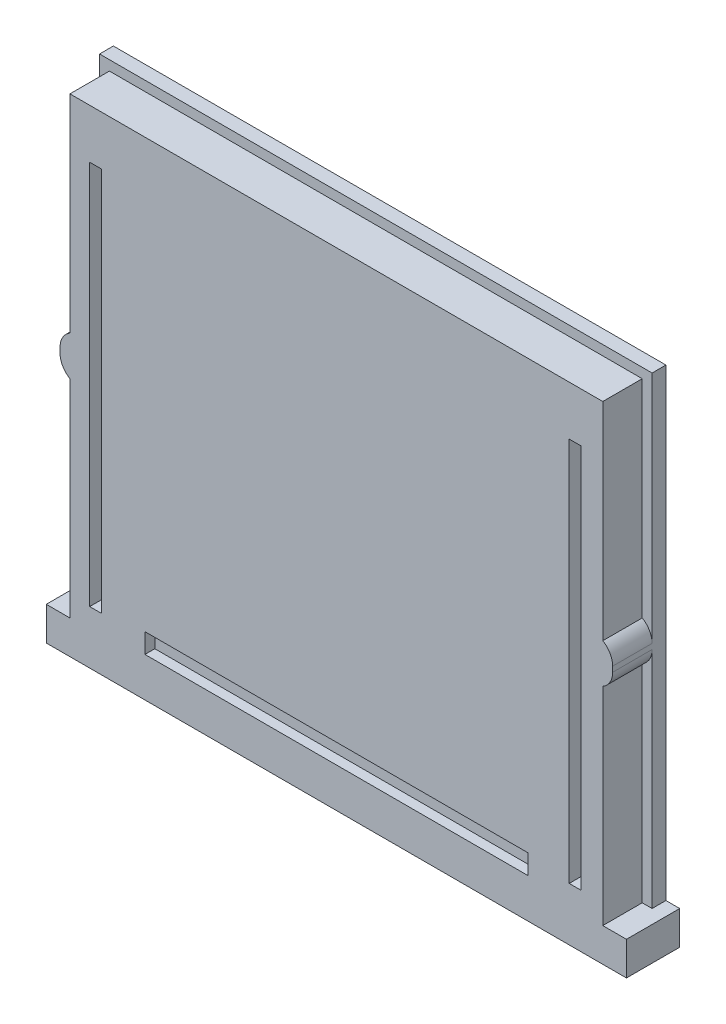
ISO-10303-21;
HEADER;
FILE_DESCRIPTION(('STEP AP214'),'2;1');
FILE_NAME('part.step','',(''),(''),'','','');
FILE_SCHEMA(('AUTOMOTIVE_DESIGN { 1 0 10303 214 1 1 1 1 }'));
ENDSEC;
DATA;
#1=APPLICATION_CONTEXT('core data for automotive mechanical design processes');
#2=APPLICATION_PROTOCOL_DEFINITION('international standard','automotive_design',2000,#1);
#3=PRODUCT_CONTEXT('',#1,'mechanical');
#4=PRODUCT('Part','Part','',(#3));
#5=PRODUCT_RELATED_PRODUCT_CATEGORY('part','',(#4));
#6=PRODUCT_DEFINITION_FORMATION('','',#4);
#7=PRODUCT_DEFINITION_CONTEXT('part definition',#1,'design');
#8=PRODUCT_DEFINITION('design','',#6,#7);
#9=PRODUCT_DEFINITION_SHAPE('','',#8);
#10=(LENGTH_UNIT() NAMED_UNIT(*) SI_UNIT(.MILLI.,.METRE.));
#11=(NAMED_UNIT(*) PLANE_ANGLE_UNIT() SI_UNIT($,.RADIAN.));
#12=(NAMED_UNIT(*) SI_UNIT($,.STERADIAN.) SOLID_ANGLE_UNIT());
#13=UNCERTAINTY_MEASURE_WITH_UNIT(LENGTH_MEASURE(1.E-05),#10,'distance_accuracy_value','');
#14=(GEOMETRIC_REPRESENTATION_CONTEXT(3) GLOBAL_UNCERTAINTY_ASSIGNED_CONTEXT((#13)) GLOBAL_UNIT_ASSIGNED_CONTEXT((#10,
#11,#12)) REPRESENTATION_CONTEXT('',''));
#15=CARTESIAN_POINT('',(0.,0.,0.));
#16=DIRECTION('',(0.,0.,1.));
#17=DIRECTION('',(1.,0.,0.));
#18=AXIS2_PLACEMENT_3D('',#15,#16,#17);
#19=CARTESIAN_POINT('',(33.3661324023902,23.,0.7));
#20=DIRECTION('',(0.,-1.,0.));
#21=DIRECTION('',(0.,0.,-1.));
#22=AXIS2_PLACEMENT_3D('',#19,#20,#21);
#23=PLANE('',#22);
#24=DIRECTION('',(1.,0.,0.));
#25=VECTOR('',#24,1.);
#26=CARTESIAN_POINT('',(5.36613240239025,23.,0.7));
#27=LINE('',#26,#25);
#28=CARTESIAN_POINT('',(5.86613240239025,23.,0.7));
#29=VERTEX_POINT('',#28);
#30=CARTESIAN_POINT('',(32.8661324023902,23.,0.7));
#31=VERTEX_POINT('',#30);
#32=EDGE_CURVE('E11',#29,#31,#27,.T.);
#33=ORIENTED_EDGE('',*,*,#32,.F.);
#34=DIRECTION('',(0.,0.,1.));
#35=VECTOR('',#34,1.);
#36=CARTESIAN_POINT('',(5.86613240239025,23.,0.));
#37=LINE('',#36,#35);
#38=CARTESIAN_POINT('',(5.86613240239025,23.,2.7));
#39=VERTEX_POINT('',#38);
#40=EDGE_CURVE('E303',#29,#39,#37,.T.);
#41=ORIENTED_EDGE('',*,*,#40,.T.);
#42=DIRECTION('',(-1.,0.,0.));
#43=VECTOR('',#42,1.);
#44=CARTESIAN_POINT('',(5.86613240239025,23.,2.7));
#45=LINE('',#44,#43);
#46=CARTESIAN_POINT('',(32.8661324023902,23.,2.7));
#47=VERTEX_POINT('',#46);
#48=EDGE_CURVE('E297',#47,#39,#45,.T.);
#49=ORIENTED_EDGE('',*,*,#48,.F.);
#50=DIRECTION('',(0.,0.,1.));
#51=VECTOR('',#50,1.);
#52=CARTESIAN_POINT('',(32.8661324023902,23.,0.));
#53=LINE('',#52,#51);
#54=EDGE_CURVE('E307',#31,#47,#53,.T.);
#55=ORIENTED_EDGE('',*,*,#54,.F.);
#56=EDGE_LOOP('',(#33,#41,#49,#55));
#57=FACE_BOUND('',#56,.T.);
#58=ADVANCED_FACE('F33',(#57),#23,.F.);
#59=CARTESIAN_POINT('',(0.,0.,0.7));
#60=DIRECTION('',(0.,0.,-1.));
#61=DIRECTION('',(-1.,0.,0.));
#62=AXIS2_PLACEMENT_3D('',#59,#60,#61);
#63=PLANE('',#62);
#64=DIRECTION('',(0.,-1.,0.));
#65=VECTOR('',#64,1.);
#66=CARTESIAN_POINT('',(5.86613240239025,22.5,0.7));
#67=LINE('',#66,#65);
#68=CARTESIAN_POINT('',(5.86613240239025,10.5,0.7));
#69=VERTEX_POINT('',#68);
#70=CARTESIAN_POINT('',(5.86613240239026,0.,0.7));
#71=VERTEX_POINT('',#70);
#72=EDGE_CURVE('E394',#69,#71,#67,.T.);
#73=ORIENTED_EDGE('',*,*,#72,.F.);
#74=CARTESIAN_POINT('',(6.36613240239025,11.3660254037844,0.7));
#75=DIRECTION('',(0.,0.,-1.));
#76=DIRECTION('',(-1.,0.,0.));
#77=AXIS2_PLACEMENT_3D('',#74,#75,#76);
#78=CIRCLE('',#77,1.);
#79=CARTESIAN_POINT('',(5.36613240239025,11.3660254037844,0.7));
#80=VERTEX_POINT('',#79);
#81=EDGE_CURVE('E473',#69,#80,#78,.T.);
#82=ORIENTED_EDGE('',*,*,#81,.T.);
#83=DIRECTION('',(0.,-1.,0.));
#84=VECTOR('',#83,1.);
#85=CARTESIAN_POINT('',(5.36613240239025,23.,0.7));
#86=LINE('',#85,#84);
#87=CARTESIAN_POINT('',(5.36613240239025,0.,0.7));
#88=VERTEX_POINT('',#87);
#89=EDGE_CURVE('E417',#80,#88,#86,.T.);
#90=ORIENTED_EDGE('',*,*,#89,.T.);
#91=DIRECTION('',(1.,0.,0.));
#92=VECTOR('',#91,1.);
#93=CARTESIAN_POINT('',(33.3661324023902,0.,0.7));
#94=LINE('',#93,#92);
#95=EDGE_CURVE('E422',#88,#71,#94,.T.);
#96=ORIENTED_EDGE('',*,*,#95,.T.);
#97=EDGE_LOOP('',(#73,#82,#90,#96));
#98=FACE_BOUND('',#97,.T.);
#99=ADVANCED_FACE('F540',(#98),#63,.F.);
#100=CARTESIAN_POINT('',(5.86613240239025,22.5,2.7));
#101=DIRECTION('',(1.,0.,0.));
#102=DIRECTION('',(0.,1.,0.));
#103=AXIS2_PLACEMENT_3D('',#100,#101,#102);
#104=PLANE('',#103);
#105=DIRECTION('',(0.,0.,1.));
#106=VECTOR('',#105,1.);
#107=CARTESIAN_POINT('',(5.86613240239025,10.5,0.7));
#108=LINE('',#107,#106);
#109=CARTESIAN_POINT('',(5.86613240239025,10.5,2.7));
#110=VERTEX_POINT('',#109);
#111=EDGE_CURVE('E316',#69,#110,#108,.T.);
#112=ORIENTED_EDGE('',*,*,#111,.F.);
#113=ORIENTED_EDGE('',*,*,#72,.T.);
#114=DIRECTION('',(0.,0.,-1.));
#115=VECTOR('',#114,1.);
#116=CARTESIAN_POINT('',(5.86613240239025,0.,2.7));
#117=LINE('',#116,#115);
#118=CARTESIAN_POINT('',(5.86613240239025,0.,2.7));
#119=VERTEX_POINT('',#118);
#120=EDGE_CURVE('E411',#119,#71,#117,.T.);
#121=ORIENTED_EDGE('',*,*,#120,.F.);
#122=DIRECTION('',(0.,-1.,0.));
#123=VECTOR('',#122,1.);
#124=CARTESIAN_POINT('',(5.86613240239025,22.5,2.7));
#125=LINE('',#124,#123);
#126=EDGE_CURVE('E398',#110,#119,#125,.T.);
#127=ORIENTED_EDGE('',*,*,#126,.F.);
#128=EDGE_LOOP('',(#112,#113,#121,#127));
#129=FACE_BOUND('',#128,.T.);
#130=ADVANCED_FACE('F548',(#129),#104,.F.);
#131=DIRECTION('',(0.,0.,-1.));
#132=VECTOR('',#131,1.);
#133=CARTESIAN_POINT('',(5.86613240239025,12.5,0.7));
#134=LINE('',#133,#132);
#135=CARTESIAN_POINT('',(5.86613240239025,12.5,2.7));
#136=VERTEX_POINT('',#135);
#137=CARTESIAN_POINT('',(5.86613240239025,12.5,0.7));
#138=VERTEX_POINT('',#137);
#139=EDGE_CURVE('E321',#136,#138,#134,.T.);
#140=ORIENTED_EDGE('',*,*,#139,.F.);
#141=EDGE_CURVE('E395',#39,#136,#125,.T.);
#142=ORIENTED_EDGE('',*,*,#141,.F.);
#143=ORIENTED_EDGE('',*,*,#40,.F.);
#144=EDGE_CURVE('E403',#29,#138,#67,.T.);
#145=ORIENTED_EDGE('',*,*,#144,.T.);
#146=EDGE_LOOP('',(#140,#142,#143,#145));
#147=FACE_BOUND('',#146,.T.);
#148=ADVANCED_FACE('F624',(#147),#104,.F.);
#149=DIRECTION('',(0.,1.,0.));
#150=VECTOR('',#149,1.);
#151=CARTESIAN_POINT('',(33.3661324023902,23.,0.7));
#152=LINE('',#151,#150);
#153=CARTESIAN_POINT('',(33.3661324023902,0.,0.7));
#154=VERTEX_POINT('',#153);
#155=CARTESIAN_POINT('',(33.3661324023902,11.3660254037844,0.7));
#156=VERTEX_POINT('',#155);
#157=EDGE_CURVE('E415',#154,#156,#152,.T.);
#158=ORIENTED_EDGE('',*,*,#157,.T.);
#159=CARTESIAN_POINT('',(32.3661324023902,11.3660254037844,0.7));
#160=DIRECTION('',(0.,0.,-1.));
#161=DIRECTION('',(-1.,0.,0.));
#162=AXIS2_PLACEMENT_3D('',#159,#160,#161);
#163=CIRCLE('',#162,1.);
#164=CARTESIAN_POINT('',(32.8661324023902,10.5,0.7));
#165=VERTEX_POINT('',#164);
#166=EDGE_CURVE('E456',#156,#165,#163,.T.);
#167=ORIENTED_EDGE('',*,*,#166,.T.);
#168=DIRECTION('',(0.,1.,0.));
#169=VECTOR('',#168,1.);
#170=CARTESIAN_POINT('',(32.8661324023902,22.5,0.7));
#171=LINE('',#170,#169);
#172=CARTESIAN_POINT('',(32.8661324023902,0.,0.7));
#173=VERTEX_POINT('',#172);
#174=EDGE_CURVE('E406',#173,#165,#171,.T.);
#175=ORIENTED_EDGE('',*,*,#174,.F.);
#176=EDGE_CURVE('E421',#173,#154,#94,.T.);
#177=ORIENTED_EDGE('',*,*,#176,.T.);
#178=EDGE_LOOP('',(#158,#167,#175,#177));
#179=FACE_BOUND('',#178,.T.);
#180=ADVANCED_FACE('F550',(#179),#63,.F.);
#181=CARTESIAN_POINT('',(33.3661324023902,11.6339745962156,0.7));
#182=VERTEX_POINT('',#181);
#183=CARTESIAN_POINT('',(33.3661324023902,23.5,0.7));
#184=VERTEX_POINT('',#183);
#185=EDGE_CURVE('E418',#182,#184,#152,.T.);
#186=ORIENTED_EDGE('',*,*,#185,.T.);
#187=DIRECTION('',(1.,0.,0.));
#188=VECTOR('',#187,1.);
#189=CARTESIAN_POINT('',(5.36613240239025,23.5,0.7));
#190=LINE('',#189,#188);
#191=CARTESIAN_POINT('',(5.36613240239025,23.5,0.7));
#192=VERTEX_POINT('',#191);
#193=EDGE_CURVE('E283',#192,#184,#190,.T.);
#194=ORIENTED_EDGE('',*,*,#193,.F.);
#195=CARTESIAN_POINT('',(5.36613240239025,11.6339745962156,0.7));
#196=VERTEX_POINT('',#195);
#197=EDGE_CURVE('E419',#192,#196,#86,.T.);
#198=ORIENTED_EDGE('',*,*,#197,.T.);
#199=CARTESIAN_POINT('',(6.36613240239025,11.6339745962156,0.7));
#200=DIRECTION('',(0.,0.,-1.));
#201=DIRECTION('',(-1.,0.,0.));
#202=AXIS2_PLACEMENT_3D('',#199,#200,#201);
#203=CIRCLE('',#202,1.);
#204=EDGE_CURVE('E471',#196,#138,#203,.T.);
#205=ORIENTED_EDGE('',*,*,#204,.T.);
#206=ORIENTED_EDGE('',*,*,#144,.F.);
#207=ORIENTED_EDGE('',*,*,#32,.T.);
#208=CARTESIAN_POINT('',(32.8661324023902,12.5,0.7));
#209=VERTEX_POINT('',#208);
#210=EDGE_CURVE('E405',#209,#31,#171,.T.);
#211=ORIENTED_EDGE('',*,*,#210,.F.);
#212=CARTESIAN_POINT('',(32.3661324023902,11.6339745962156,0.7));
#213=DIRECTION('',(0.,0.,-1.));
#214=DIRECTION('',(-1.,0.,0.));
#215=AXIS2_PLACEMENT_3D('',#212,#213,#214);
#216=CIRCLE('',#215,1.);
#217=EDGE_CURVE('E458',#209,#182,#216,.T.);
#218=ORIENTED_EDGE('',*,*,#217,.T.);
#219=EDGE_LOOP('',(#186,#194,#198,#205,#206,#207,#211,#218));
#220=FACE_BOUND('',#219,.T.);
#221=ADVANCED_FACE('F551',(#220),#63,.F.);
#222=CARTESIAN_POINT('',(32.8661324023902,22.5,2.7));
#223=DIRECTION('',(-1.,0.,0.));
#224=DIRECTION('',(0.,-1.,0.));
#225=AXIS2_PLACEMENT_3D('',#222,#223,#224);
#226=PLANE('',#225);
#227=DIRECTION('',(0.,0.,-1.));
#228=VECTOR('',#227,1.);
#229=CARTESIAN_POINT('',(32.8661324023902,10.5,2.7));
#230=LINE('',#229,#228);
#231=CARTESIAN_POINT('',(32.8661324023902,10.5,2.7));
#232=VERTEX_POINT('',#231);
#233=EDGE_CURVE('E320',#232,#165,#230,.T.);
#234=ORIENTED_EDGE('',*,*,#233,.F.);
#235=DIRECTION('',(0.,1.,0.));
#236=VECTOR('',#235,1.);
#237=CARTESIAN_POINT('',(32.8661324023902,22.5,2.7));
#238=LINE('',#237,#236);
#239=CARTESIAN_POINT('',(32.8661324023902,0.,2.7));
#240=VERTEX_POINT('',#239);
#241=EDGE_CURVE('E399',#240,#232,#238,.T.);
#242=ORIENTED_EDGE('',*,*,#241,.F.);
#243=DIRECTION('',(0.,0.,-1.));
#244=VECTOR('',#243,1.);
#245=CARTESIAN_POINT('',(32.8661324023902,0.,2.7));
#246=LINE('',#245,#244);
#247=EDGE_CURVE('E402',#240,#173,#246,.T.);
#248=ORIENTED_EDGE('',*,*,#247,.T.);
#249=ORIENTED_EDGE('',*,*,#174,.T.);
#250=EDGE_LOOP('',(#234,#242,#248,#249));
#251=FACE_BOUND('',#250,.T.);
#252=ADVANCED_FACE('F610',(#251),#226,.F.);
#253=ORIENTED_EDGE('',*,*,#210,.T.);
#254=ORIENTED_EDGE('',*,*,#54,.T.);
#255=CARTESIAN_POINT('',(32.8661324023902,12.5,2.7));
#256=VERTEX_POINT('',#255);
#257=EDGE_CURVE('E397',#256,#47,#238,.T.);
#258=ORIENTED_EDGE('',*,*,#257,.F.);
#259=DIRECTION('',(0.,0.,1.));
#260=VECTOR('',#259,1.);
#261=CARTESIAN_POINT('',(32.8661324023902,12.5,2.7));
#262=LINE('',#261,#260);
#263=EDGE_CURVE('E330',#209,#256,#262,.T.);
#264=ORIENTED_EDGE('',*,*,#263,.F.);
#265=EDGE_LOOP('',(#253,#254,#258,#264));
#266=FACE_BOUND('',#265,.T.);
#267=ADVANCED_FACE('F559',(#266),#226,.F.);
#268=CARTESIAN_POINT('',(33.3661324023902,23.,0.7));
#269=DIRECTION('',(-1.,0.,0.));
#270=DIRECTION('',(0.,0.,1.));
#271=AXIS2_PLACEMENT_3D('',#268,#269,#270);
#272=PLANE('',#271);
#273=DIRECTION('',(0.,-1.,0.));
#274=VECTOR('',#273,1.);
#275=CARTESIAN_POINT('',(33.3661324023902,12.5,2.7));
#276=LINE('',#275,#274);
#277=CARTESIAN_POINT('',(33.3661324023902,11.6339745962156,2.7));
#278=VERTEX_POINT('',#277);
#279=CARTESIAN_POINT('',(33.3661324023902,11.3660254037844,2.7));
#280=VERTEX_POINT('',#279);
#281=EDGE_CURVE('E326',#278,#280,#276,.T.);
#282=ORIENTED_EDGE('',*,*,#281,.T.);
#283=DIRECTION('',(0.,0.,1.));
#284=VECTOR('',#283,1.);
#285=CARTESIAN_POINT('',(33.3661324023902,11.3660254037844,0.7));
#286=LINE('',#285,#284);
#287=EDGE_CURVE('E449',#280,#156,#286,.F.);
#288=ORIENTED_EDGE('',*,*,#287,.T.);
#289=ORIENTED_EDGE('',*,*,#157,.F.);
#290=DIRECTION('',(0.,0.,-1.));
#291=VECTOR('',#290,1.);
#292=CARTESIAN_POINT('',(33.3661324023902,0.,0.7));
#293=LINE('',#292,#291);
#294=CARTESIAN_POINT('',(33.3661324023902,0.,0.));
#295=VERTEX_POINT('',#294);
#296=EDGE_CURVE('E425',#154,#295,#293,.T.);
#297=ORIENTED_EDGE('',*,*,#296,.T.);
#298=DIRECTION('',(0.,1.,0.));
#299=VECTOR('',#298,1.);
#300=CARTESIAN_POINT('',(33.3661324023902,23.,0.));
#301=LINE('',#300,#299);
#302=CARTESIAN_POINT('',(33.3661324023902,23.5,0.));
#303=VERTEX_POINT('',#302);
#304=EDGE_CURVE('E414',#295,#303,#301,.T.);
#305=ORIENTED_EDGE('',*,*,#304,.T.);
#306=DIRECTION('',(0.,0.,-1.));
#307=VECTOR('',#306,1.);
#308=CARTESIAN_POINT('',(33.3661324023902,23.5,0.));
#309=LINE('',#308,#307);
#310=EDGE_CURVE('E286',#184,#303,#309,.T.);
#311=ORIENTED_EDGE('',*,*,#310,.F.);
#312=ORIENTED_EDGE('',*,*,#185,.F.);
#313=DIRECTION('',(0.,0.,-1.));
#314=VECTOR('',#313,1.);
#315=CARTESIAN_POINT('',(33.3661324023902,11.6339745962156,0.7));
#316=LINE('',#315,#314);
#317=EDGE_CURVE('E446',#182,#278,#316,.F.);
#318=ORIENTED_EDGE('',*,*,#317,.T.);
#319=EDGE_LOOP('',(#282,#288,#289,#297,#305,#311,#312,#318));
#320=FACE_BOUND('',#319,.T.);
#321=ADVANCED_FACE('F556',(#320),#272,.F.);
#322=CARTESIAN_POINT('',(5.36613240239025,23.,0.7));
#323=DIRECTION('',(1.,0.,0.));
#324=DIRECTION('',(0.,0.,-1.));
#325=AXIS2_PLACEMENT_3D('',#322,#323,#324);
#326=PLANE('',#325);
#327=DIRECTION('',(0.,1.,0.));
#328=VECTOR('',#327,1.);
#329=CARTESIAN_POINT('',(5.36613240239025,12.5,2.7));
#330=LINE('',#329,#328);
#331=CARTESIAN_POINT('',(5.36613240239025,11.3660254037844,2.7));
#332=VERTEX_POINT('',#331);
#333=CARTESIAN_POINT('',(5.36613240239025,11.6339745962156,2.7));
#334=VERTEX_POINT('',#333);
#335=EDGE_CURVE('E317',#332,#334,#330,.T.);
#336=ORIENTED_EDGE('',*,*,#335,.T.);
#337=DIRECTION('',(0.,0.,1.));
#338=VECTOR('',#337,1.);
#339=CARTESIAN_POINT('',(5.36613240239025,11.6339745962156,0.7));
#340=LINE('',#339,#338);
#341=EDGE_CURVE('E464',#334,#196,#340,.F.);
#342=ORIENTED_EDGE('',*,*,#341,.T.);
#343=ORIENTED_EDGE('',*,*,#197,.F.);
#344=DIRECTION('',(0.,0.,1.));
#345=VECTOR('',#344,1.);
#346=CARTESIAN_POINT('',(5.36613240239025,23.5,0.));
#347=LINE('',#346,#345);
#348=CARTESIAN_POINT('',(5.36613240239025,23.5,0.));
#349=VERTEX_POINT('',#348);
#350=EDGE_CURVE('E277',#349,#192,#347,.T.);
#351=ORIENTED_EDGE('',*,*,#350,.F.);
#352=DIRECTION('',(0.,-1.,0.));
#353=VECTOR('',#352,1.);
#354=CARTESIAN_POINT('',(5.36613240239025,23.,0.));
#355=LINE('',#354,#353);
#356=CARTESIAN_POINT('',(5.36613240239025,0.,0.));
#357=VERTEX_POINT('',#356);
#358=EDGE_CURVE('E427',#349,#357,#355,.T.);
#359=ORIENTED_EDGE('',*,*,#358,.T.);
#360=DIRECTION('',(0.,0.,-1.));
#361=VECTOR('',#360,1.);
#362=CARTESIAN_POINT('',(5.36613240239025,0.,0.7));
#363=LINE('',#362,#361);
#364=EDGE_CURVE('E430',#88,#357,#363,.T.);
#365=ORIENTED_EDGE('',*,*,#364,.F.);
#366=ORIENTED_EDGE('',*,*,#89,.F.);
#367=DIRECTION('',(0.,0.,-1.));
#368=VECTOR('',#367,1.);
#369=CARTESIAN_POINT('',(5.36613240239025,11.3660254037844,0.7));
#370=LINE('',#369,#368);
#371=EDGE_CURVE('E461',#80,#332,#370,.F.);
#372=ORIENTED_EDGE('',*,*,#371,.T.);
#373=EDGE_LOOP('',(#336,#342,#343,#351,#359,#365,#366,#372));
#374=FACE_BOUND('',#373,.T.);
#375=ADVANCED_FACE('F554',(#374),#326,.F.);
#376=CARTESIAN_POINT('',(0.,0.,0.));
#377=DIRECTION('',(0.,0.,-1.));
#378=DIRECTION('',(-1.,0.,0.));
#379=AXIS2_PLACEMENT_3D('',#376,#377,#378);
#380=PLANE('',#379);
#381=ORIENTED_EDGE('',*,*,#358,.F.);
#382=DIRECTION('',(-1.,0.,0.));
#383=VECTOR('',#382,1.);
#384=CARTESIAN_POINT('',(5.36613240239025,23.5,0.));
#385=LINE('',#384,#383);
#386=EDGE_CURVE('E289',#303,#349,#385,.T.);
#387=ORIENTED_EDGE('',*,*,#386,.F.);
#388=ORIENTED_EDGE('',*,*,#304,.F.);
#389=DIRECTION('',(1.,0.,0.));
#390=VECTOR('',#389,1.);
#391=CARTESIAN_POINT('',(34.0661324023903,0.,0.));
#392=LINE('',#391,#390);
#393=CARTESIAN_POINT('',(34.0661324023903,0.,0.));
#394=VERTEX_POINT('',#393);
#395=EDGE_CURVE('E373',#295,#394,#392,.T.);
#396=ORIENTED_EDGE('',*,*,#395,.T.);
#397=DIRECTION('',(0.,1.,0.));
#398=VECTOR('',#397,1.);
#399=CARTESIAN_POINT('',(34.0661324023903,-1.7,0.));
#400=LINE('',#399,#398);
#401=CARTESIAN_POINT('',(34.0661324023903,-1.7,0.));
#402=VERTEX_POINT('',#401);
#403=EDGE_CURVE('E385',#402,#394,#400,.T.);
#404=ORIENTED_EDGE('',*,*,#403,.F.);
#405=DIRECTION('',(1.,0.,0.));
#406=VECTOR('',#405,1.);
#407=CARTESIAN_POINT('',(4.66613240239025,-1.7,0.));
#408=LINE('',#407,#406);
#409=CARTESIAN_POINT('',(4.66613240239025,-1.7,0.));
#410=VERTEX_POINT('',#409);
#411=EDGE_CURVE('E365',#410,#402,#408,.T.);
#412=ORIENTED_EDGE('',*,*,#411,.F.);
#413=DIRECTION('',(0.,1.,0.));
#414=VECTOR('',#413,1.);
#415=CARTESIAN_POINT('',(4.66613240239025,-1.7,0.));
#416=LINE('',#415,#414);
#417=CARTESIAN_POINT('',(4.66613240239025,0.,0.));
#418=VERTEX_POINT('',#417);
#419=EDGE_CURVE('E388',#410,#418,#416,.T.);
#420=ORIENTED_EDGE('',*,*,#419,.T.);
#421=EDGE_CURVE('E374',#418,#357,#392,.T.);
#422=ORIENTED_EDGE('',*,*,#421,.T.);
#423=EDGE_LOOP('',(#381,#387,#388,#396,#404,#412,#420,#422));
#424=FACE_BOUND('',#423,.T.);
#425=DIRECTION('',(0.,-1.,0.));
#426=VECTOR('',#425,1.);
#427=CARTESIAN_POINT('',(31.7661324023902,23.,0.));
#428=LINE('',#427,#426);
#429=CARTESIAN_POINT('',(31.7661324023902,20.5,0.));
#430=VERTEX_POINT('',#429);
#431=CARTESIAN_POINT('',(31.7661324023903,1.,0.));
#432=VERTEX_POINT('',#431);
#433=EDGE_CURVE('E344',#430,#432,#428,.T.);
#434=ORIENTED_EDGE('',*,*,#433,.F.);
#435=DIRECTION('',(1.,0.,0.));
#436=VECTOR('',#435,1.);
#437=CARTESIAN_POINT('',(5.86613240239025,20.5,0.));
#438=LINE('',#437,#436);
#439=CARTESIAN_POINT('',(31.1661324023903,20.5,0.));
#440=VERTEX_POINT('',#439);
#441=EDGE_CURVE('E293',#440,#430,#438,.T.);
#442=ORIENTED_EDGE('',*,*,#441,.F.);
#443=DIRECTION('',(0.,1.,0.));
#444=VECTOR('',#443,1.);
#445=CARTESIAN_POINT('',(31.1661324023903,23.,0.));
#446=LINE('',#445,#444);
#447=CARTESIAN_POINT('',(31.1661324023902,1.,0.));
#448=VERTEX_POINT('',#447);
#449=EDGE_CURVE('E351',#448,#440,#446,.T.);
#450=ORIENTED_EDGE('',*,*,#449,.F.);
#451=DIRECTION('',(-1.,0.,0.));
#452=VECTOR('',#451,1.);
#453=CARTESIAN_POINT('',(31.7661324023903,1.,0.));
#454=LINE('',#453,#452);
#455=EDGE_CURVE('E348',#432,#448,#454,.T.);
#456=ORIENTED_EDGE('',*,*,#455,.F.);
#457=EDGE_LOOP('',(#434,#442,#450,#456));
#458=FACE_BOUND('',#457,.T.);
#459=DIRECTION('',(0.,-1.,0.));
#460=VECTOR('',#459,1.);
#461=CARTESIAN_POINT('',(7.46613240239025,23.,0.));
#462=LINE('',#461,#460);
#463=CARTESIAN_POINT('',(7.46613240239025,20.5,0.));
#464=VERTEX_POINT('',#463);
#465=CARTESIAN_POINT('',(7.46613240239025,1.,0.));
#466=VERTEX_POINT('',#465);
#467=EDGE_CURVE('E336',#464,#466,#462,.T.);
#468=ORIENTED_EDGE('',*,*,#467,.F.);
#469=CARTESIAN_POINT('',(6.86613240239025,20.5,0.));
#470=VERTEX_POINT('',#469);
#471=EDGE_CURVE('E296',#470,#464,#438,.T.);
#472=ORIENTED_EDGE('',*,*,#471,.F.);
#473=DIRECTION('',(0.,1.,0.));
#474=VECTOR('',#473,1.);
#475=CARTESIAN_POINT('',(6.86613240239025,23.,0.));
#476=LINE('',#475,#474);
#477=CARTESIAN_POINT('',(6.86613240239025,1.,0.));
#478=VERTEX_POINT('',#477);
#479=EDGE_CURVE('E329',#478,#470,#476,.T.);
#480=ORIENTED_EDGE('',*,*,#479,.F.);
#481=DIRECTION('',(-1.,0.,0.));
#482=VECTOR('',#481,1.);
#483=CARTESIAN_POINT('',(6.86613240239025,1.,0.));
#484=LINE('',#483,#482);
#485=EDGE_CURVE('E338',#466,#478,#484,.T.);
#486=ORIENTED_EDGE('',*,*,#485,.F.);
#487=EDGE_LOOP('',(#468,#472,#480,#486));
#488=FACE_BOUND('',#487,.T.);
#489=ADVANCED_FACE('F491',(#424,#458,#488),#380,.T.);
#490=CARTESIAN_POINT('',(0.,0.,2.7));
#491=DIRECTION('',(0.,0.,1.));
#492=DIRECTION('',(1.,0.,0.));
#493=AXIS2_PLACEMENT_3D('',#490,#491,#492);
#494=PLANE('',#493);
#495=DIRECTION('',(0.,-1.,0.));
#496=VECTOR('',#495,1.);
#497=CARTESIAN_POINT('',(9.66613240239025,1.3,2.7));
#498=LINE('',#497,#496);
#499=CARTESIAN_POINT('',(9.66613240239025,1.3,2.7));
#500=VERTEX_POINT('',#499);
#501=CARTESIAN_POINT('',(9.66613240239025,0.3,2.7));
#502=VERTEX_POINT('',#501);
#503=EDGE_CURVE('E49',#500,#502,#498,.T.);
#504=ORIENTED_EDGE('',*,*,#503,.F.);
#505=DIRECTION('',(-1.,0.,0.));
#506=VECTOR('',#505,1.);
#507=CARTESIAN_POINT('',(9.66613240239025,1.3,2.7));
#508=LINE('',#507,#506);
#509=CARTESIAN_POINT('',(29.0661324023903,1.3,2.7));
#510=VERTEX_POINT('',#509);
#511=EDGE_CURVE('E262',#510,#500,#508,.T.);
#512=ORIENTED_EDGE('',*,*,#511,.F.);
#513=DIRECTION('',(0.,1.,0.));
#514=VECTOR('',#513,1.);
#515=CARTESIAN_POINT('',(29.0661324023903,1.3,2.7));
#516=LINE('',#515,#514);
#517=CARTESIAN_POINT('',(29.0661324023903,0.3,2.7));
#518=VERTEX_POINT('',#517);
#519=EDGE_CURVE('E265',#518,#510,#516,.T.);
#520=ORIENTED_EDGE('',*,*,#519,.F.);
#521=DIRECTION('',(1.,0.,0.));
#522=VECTOR('',#521,1.);
#523=CARTESIAN_POINT('',(9.66613240239025,0.3,2.7));
#524=LINE('',#523,#522);
#525=EDGE_CURVE('E271',#502,#518,#524,.T.);
#526=ORIENTED_EDGE('',*,*,#525,.F.);
#527=EDGE_LOOP('',(#504,#512,#520,#526));
#528=FACE_BOUND('',#527,.T.);
#529=ORIENTED_EDGE('',*,*,#48,.T.);
#530=ORIENTED_EDGE('',*,*,#141,.T.);
#531=CARTESIAN_POINT('',(6.36613240239025,11.6339745962156,2.7));
#532=DIRECTION('',(0.,0.,1.));
#533=DIRECTION('',(1.,0.,0.));
#534=AXIS2_PLACEMENT_3D('',#531,#532,#533);
#535=CIRCLE('',#534,1.);
#536=EDGE_CURVE('E469',#136,#334,#535,.T.);
#537=ORIENTED_EDGE('',*,*,#536,.T.);
#538=ORIENTED_EDGE('',*,*,#335,.F.);
#539=CARTESIAN_POINT('',(6.36613240239025,11.3660254037844,2.7));
#540=DIRECTION('',(0.,0.,1.));
#541=DIRECTION('',(1.,0.,0.));
#542=AXIS2_PLACEMENT_3D('',#539,#540,#541);
#543=CIRCLE('',#542,1.);
#544=EDGE_CURVE('E467',#332,#110,#543,.T.);
#545=ORIENTED_EDGE('',*,*,#544,.T.);
#546=ORIENTED_EDGE('',*,*,#126,.T.);
#547=DIRECTION('',(-1.,0.,0.));
#548=VECTOR('',#547,1.);
#549=CARTESIAN_POINT('',(5.86613240239025,0.,2.7));
#550=LINE('',#549,#548);
#551=CARTESIAN_POINT('',(4.66613240239025,0.,2.7));
#552=VERTEX_POINT('',#551);
#553=EDGE_CURVE('E380',#119,#552,#550,.T.);
#554=ORIENTED_EDGE('',*,*,#553,.T.);
#555=DIRECTION('',(0.,1.,0.));
#556=VECTOR('',#555,1.);
#557=CARTESIAN_POINT('',(4.66613240239025,-1.7,2.7));
#558=LINE('',#557,#556);
#559=CARTESIAN_POINT('',(4.66613240239025,-1.7,2.7));
#560=VERTEX_POINT('',#559);
#561=EDGE_CURVE('E391',#560,#552,#558,.T.);
#562=ORIENTED_EDGE('',*,*,#561,.F.);
#563=DIRECTION('',(-1.,0.,0.));
#564=VECTOR('',#563,1.);
#565=CARTESIAN_POINT('',(5.86613240239025,-1.7,2.7));
#566=LINE('',#565,#564);
#567=CARTESIAN_POINT('',(34.0661324023903,-1.7,2.7));
#568=VERTEX_POINT('',#567);
#569=EDGE_CURVE('E359',#568,#560,#566,.T.);
#570=ORIENTED_EDGE('',*,*,#569,.F.);
#571=DIRECTION('',(0.,1.,0.));
#572=VECTOR('',#571,1.);
#573=CARTESIAN_POINT('',(34.0661324023903,-1.7,2.7));
#574=LINE('',#573,#572);
#575=CARTESIAN_POINT('',(34.0661324023903,0.,2.7));
#576=VERTEX_POINT('',#575);
#577=EDGE_CURVE('E370',#568,#576,#574,.T.);
#578=ORIENTED_EDGE('',*,*,#577,.T.);
#579=EDGE_CURVE('E363',#576,#240,#550,.T.);
#580=ORIENTED_EDGE('',*,*,#579,.T.);
#581=ORIENTED_EDGE('',*,*,#241,.T.);
#582=CARTESIAN_POINT('',(32.3661324023902,11.3660254037844,2.7));
#583=DIRECTION('',(0.,0.,1.));
#584=DIRECTION('',(1.,0.,0.));
#585=AXIS2_PLACEMENT_3D('',#582,#583,#584);
#586=CIRCLE('',#585,1.);
#587=EDGE_CURVE('E454',#232,#280,#586,.T.);
#588=ORIENTED_EDGE('',*,*,#587,.T.);
#589=ORIENTED_EDGE('',*,*,#281,.F.);
#590=CARTESIAN_POINT('',(32.3661324023902,11.6339745962156,2.7));
#591=DIRECTION('',(0.,0.,1.));
#592=DIRECTION('',(1.,0.,0.));
#593=AXIS2_PLACEMENT_3D('',#590,#591,#592);
#594=CIRCLE('',#593,1.);
#595=EDGE_CURVE('E452',#278,#256,#594,.T.);
#596=ORIENTED_EDGE('',*,*,#595,.T.);
#597=ORIENTED_EDGE('',*,*,#257,.T.);
#598=EDGE_LOOP('',(#529,#530,#537,#538,#545,#546,#554,#562,#570,#578,#580,#581,#588,#589,#596,#597));
#599=FACE_BOUND('',#598,.T.);
#600=DIRECTION('',(0.,-1.,0.));
#601=VECTOR('',#600,1.);
#602=CARTESIAN_POINT('',(6.86613240239025,0.,2.7));
#603=LINE('',#602,#601);
#604=CARTESIAN_POINT('',(6.86613240239025,20.5,2.7));
#605=VERTEX_POINT('',#604);
#606=CARTESIAN_POINT('',(6.86613240239025,1.,2.7));
#607=VERTEX_POINT('',#606);
#608=EDGE_CURVE('E444',#605,#607,#603,.T.);
#609=ORIENTED_EDGE('',*,*,#608,.F.);
#610=DIRECTION('',(1.,0.,0.));
#611=VECTOR('',#610,1.);
#612=CARTESIAN_POINT('',(5.86613240239025,20.5,2.7));
#613=LINE('',#612,#611);
#614=CARTESIAN_POINT('',(7.46613240239025,20.5,2.7));
#615=VERTEX_POINT('',#614);
#616=EDGE_CURVE('E300',#605,#615,#613,.T.);
#617=ORIENTED_EDGE('',*,*,#616,.T.);
#618=DIRECTION('',(0.,1.,0.));
#619=VECTOR('',#618,1.);
#620=CARTESIAN_POINT('',(7.46613240239025,0.,2.7));
#621=LINE('',#620,#619);
#622=CARTESIAN_POINT('',(7.46613240239025,1.,2.7));
#623=VERTEX_POINT('',#622);
#624=EDGE_CURVE('E439',#623,#615,#621,.T.);
#625=ORIENTED_EDGE('',*,*,#624,.F.);
#626=DIRECTION('',(1.,0.,0.));
#627=VECTOR('',#626,1.);
#628=CARTESIAN_POINT('',(0.,1.,2.7));
#629=LINE('',#628,#627);
#630=EDGE_CURVE('E441',#607,#623,#629,.T.);
#631=ORIENTED_EDGE('',*,*,#630,.F.);
#632=EDGE_LOOP('',(#609,#617,#625,#631));
#633=FACE_BOUND('',#632,.T.);
#634=DIRECTION('',(0.,-1.,0.));
#635=VECTOR('',#634,1.);
#636=CARTESIAN_POINT('',(31.1661324023902,0.,2.7));
#637=LINE('',#636,#635);
#638=CARTESIAN_POINT('',(31.1661324023903,20.5,2.7));
#639=VERTEX_POINT('',#638);
#640=CARTESIAN_POINT('',(31.1661324023902,1.,2.7));
#641=VERTEX_POINT('',#640);
#642=EDGE_CURVE('E435',#639,#641,#637,.T.);
#643=ORIENTED_EDGE('',*,*,#642,.F.);
#644=CARTESIAN_POINT('',(31.7661324023902,20.5,2.7));
#645=VERTEX_POINT('',#644);
#646=EDGE_CURVE('E291',#639,#645,#613,.T.);
#647=ORIENTED_EDGE('',*,*,#646,.T.);
#648=DIRECTION('',(0.,1.,0.));
#649=VECTOR('',#648,1.);
#650=CARTESIAN_POINT('',(31.7661324023903,0.,2.7));
#651=LINE('',#650,#649);
#652=CARTESIAN_POINT('',(31.7661324023903,1.,2.7));
#653=VERTEX_POINT('',#652);
#654=EDGE_CURVE('E437',#653,#645,#651,.T.);
#655=ORIENTED_EDGE('',*,*,#654,.F.);
#656=DIRECTION('',(1.,0.,0.));
#657=VECTOR('',#656,1.);
#658=CARTESIAN_POINT('',(0.,1.,2.7));
#659=LINE('',#658,#657);
#660=EDGE_CURVE('E433',#641,#653,#659,.T.);
#661=ORIENTED_EDGE('',*,*,#660,.F.);
#662=EDGE_LOOP('',(#643,#647,#655,#661));
#663=FACE_BOUND('',#662,.T.);
#664=ADVANCED_FACE('F502',(#528,#599,#633,#663),#494,.T.);
#665=CARTESIAN_POINT('',(0.,0.,0.));
#666=DIRECTION('',(0.,-1.,0.));
#667=DIRECTION('',(0.,0.,-1.));
#668=AXIS2_PLACEMENT_3D('',#665,#666,#667);
#669=PLANE('',#668);
#670=ORIENTED_EDGE('',*,*,#553,.F.);
#671=ORIENTED_EDGE('',*,*,#120,.T.);
#672=ORIENTED_EDGE('',*,*,#95,.F.);
#673=ORIENTED_EDGE('',*,*,#364,.T.);
#674=ORIENTED_EDGE('',*,*,#421,.F.);
#675=DIRECTION('',(0.,0.,-1.));
#676=VECTOR('',#675,1.);
#677=CARTESIAN_POINT('',(4.66613240239025,0.,2.7));
#678=LINE('',#677,#676);
#679=EDGE_CURVE('E356',#552,#418,#678,.T.);
#680=ORIENTED_EDGE('',*,*,#679,.F.);
#681=EDGE_LOOP('',(#670,#671,#672,#673,#674,#680));
#682=FACE_BOUND('',#681,.T.);
#683=ADVANCED_FACE('F505',(#682),#669,.F.);
#684=CARTESIAN_POINT('',(4.66613240239025,-1.7,2.7));
#685=DIRECTION('',(1.,0.,0.));
#686=DIRECTION('',(0.,0.,-1.));
#687=AXIS2_PLACEMENT_3D('',#684,#685,#686);
#688=PLANE('',#687);
#689=ORIENTED_EDGE('',*,*,#679,.T.);
#690=ORIENTED_EDGE('',*,*,#419,.F.);
#691=DIRECTION('',(0.,0.,-1.));
#692=VECTOR('',#691,1.);
#693=CARTESIAN_POINT('',(4.66613240239025,-1.7,2.7));
#694=LINE('',#693,#692);
#695=EDGE_CURVE('E362',#560,#410,#694,.T.);
#696=ORIENTED_EDGE('',*,*,#695,.F.);
#697=ORIENTED_EDGE('',*,*,#561,.T.);
#698=EDGE_LOOP('',(#689,#690,#696,#697));
#699=FACE_BOUND('',#698,.T.);
#700=ADVANCED_FACE('F592',(#699),#688,.F.);
#701=CARTESIAN_POINT('',(34.0661324023903,-1.7,2.7));
#702=DIRECTION('',(-1.,0.,0.));
#703=DIRECTION('',(0.,0.,1.));
#704=AXIS2_PLACEMENT_3D('',#701,#702,#703);
#705=PLANE('',#704);
#706=DIRECTION('',(0.,0.,1.));
#707=VECTOR('',#706,1.);
#708=CARTESIAN_POINT('',(34.0661324023903,0.,2.7));
#709=LINE('',#708,#707);
#710=EDGE_CURVE('E377',#394,#576,#709,.T.);
#711=ORIENTED_EDGE('',*,*,#710,.T.);
#712=ORIENTED_EDGE('',*,*,#577,.F.);
#713=DIRECTION('',(0.,0.,1.));
#714=VECTOR('',#713,1.);
#715=CARTESIAN_POINT('',(34.0661324023903,-1.7,2.7));
#716=LINE('',#715,#714);
#717=EDGE_CURVE('E367',#402,#568,#716,.T.);
#718=ORIENTED_EDGE('',*,*,#717,.F.);
#719=ORIENTED_EDGE('',*,*,#403,.T.);
#720=EDGE_LOOP('',(#711,#712,#718,#719));
#721=FACE_BOUND('',#720,.T.);
#722=ADVANCED_FACE('F601',(#721),#705,.F.);
#723=CARTESIAN_POINT('',(0.,-1.7,0.));
#724=DIRECTION('',(0.,-1.,0.));
#725=DIRECTION('',(0.,0.,-1.));
#726=AXIS2_PLACEMENT_3D('',#723,#724,#725);
#727=PLANE('',#726);
#728=ORIENTED_EDGE('',*,*,#569,.T.);
#729=ORIENTED_EDGE('',*,*,#695,.T.);
#730=ORIENTED_EDGE('',*,*,#411,.T.);
#731=ORIENTED_EDGE('',*,*,#717,.T.);
#732=EDGE_LOOP('',(#728,#729,#730,#731));
#733=FACE_BOUND('',#732,.T.);
#734=ADVANCED_FACE('F596',(#733),#727,.T.);
#735=ORIENTED_EDGE('',*,*,#296,.F.);
#736=ORIENTED_EDGE('',*,*,#176,.F.);
#737=ORIENTED_EDGE('',*,*,#247,.F.);
#738=ORIENTED_EDGE('',*,*,#579,.F.);
#739=ORIENTED_EDGE('',*,*,#710,.F.);
#740=ORIENTED_EDGE('',*,*,#395,.F.);
#741=EDGE_LOOP('',(#735,#736,#737,#738,#739,#740));
#742=FACE_BOUND('',#741,.T.);
#743=ADVANCED_FACE('F536',(#742),#669,.F.);
#744=CARTESIAN_POINT('',(31.7661324023902,23.,10.));
#745=DIRECTION('',(1.,0.,0.));
#746=DIRECTION('',(0.,1.,0.));
#747=AXIS2_PLACEMENT_3D('',#744,#745,#746);
#748=PLANE('',#747);
#749=ORIENTED_EDGE('',*,*,#654,.T.);
#750=DIRECTION('',(0.,0.,-1.));
#751=VECTOR('',#750,1.);
#752=CARTESIAN_POINT('',(31.7661324023902,20.5,10.));
#753=LINE('',#752,#751);
#754=EDGE_CURVE('E314',#645,#430,#753,.T.);
#755=ORIENTED_EDGE('',*,*,#754,.T.);
#756=ORIENTED_EDGE('',*,*,#433,.T.);
#757=DIRECTION('',(0.,0.,-1.));
#758=VECTOR('',#757,1.);
#759=CARTESIAN_POINT('',(31.7661324023903,1.,10.));
#760=LINE('',#759,#758);
#761=EDGE_CURVE('E353',#653,#432,#760,.T.);
#762=ORIENTED_EDGE('',*,*,#761,.F.);
#763=EDGE_LOOP('',(#749,#755,#756,#762));
#764=FACE_BOUND('',#763,.T.);
#765=ADVANCED_FACE('F521',(#764),#748,.F.);
#766=CARTESIAN_POINT('',(31.1661324023903,23.,10.));
#767=DIRECTION('',(-1.,0.,0.));
#768=DIRECTION('',(0.,-1.,0.));
#769=AXIS2_PLACEMENT_3D('',#766,#767,#768);
#770=PLANE('',#769);
#771=ORIENTED_EDGE('',*,*,#449,.T.);
#772=DIRECTION('',(0.,0.,1.));
#773=VECTOR('',#772,1.);
#774=CARTESIAN_POINT('',(31.1661324023903,20.5,10.));
#775=LINE('',#774,#773);
#776=EDGE_CURVE('E312',#440,#639,#775,.T.);
#777=ORIENTED_EDGE('',*,*,#776,.T.);
#778=ORIENTED_EDGE('',*,*,#642,.T.);
#779=DIRECTION('',(0.,0.,-1.));
#780=VECTOR('',#779,1.);
#781=CARTESIAN_POINT('',(31.1661324023902,1.,10.));
#782=LINE('',#781,#780);
#783=EDGE_CURVE('E354',#641,#448,#782,.T.);
#784=ORIENTED_EDGE('',*,*,#783,.T.);
#785=EDGE_LOOP('',(#771,#777,#778,#784));
#786=FACE_BOUND('',#785,.T.);
#787=ADVANCED_FACE('F528',(#786),#770,.F.);
#788=CARTESIAN_POINT('',(31.7661324023903,1.,10.));
#789=DIRECTION('',(0.,-1.,0.));
#790=DIRECTION('',(0.,0.,-1.));
#791=AXIS2_PLACEMENT_3D('',#788,#789,#790);
#792=PLANE('',#791);
#793=ORIENTED_EDGE('',*,*,#660,.T.);
#794=ORIENTED_EDGE('',*,*,#761,.T.);
#795=ORIENTED_EDGE('',*,*,#455,.T.);
#796=ORIENTED_EDGE('',*,*,#783,.F.);
#797=EDGE_LOOP('',(#793,#794,#795,#796));
#798=FACE_BOUND('',#797,.T.);
#799=ADVANCED_FACE('F527',(#798),#792,.F.);
#800=CARTESIAN_POINT('',(6.86613240239025,23.,10.));
#801=DIRECTION('',(-1.,0.,0.));
#802=DIRECTION('',(0.,-1.,0.));
#803=AXIS2_PLACEMENT_3D('',#800,#801,#802);
#804=PLANE('',#803);
#805=ORIENTED_EDGE('',*,*,#479,.T.);
#806=DIRECTION('',(0.,0.,1.));
#807=VECTOR('',#806,1.);
#808=CARTESIAN_POINT('',(6.86613240239025,20.5,10.));
#809=LINE('',#808,#807);
#810=EDGE_CURVE('E306',#470,#605,#809,.T.);
#811=ORIENTED_EDGE('',*,*,#810,.T.);
#812=ORIENTED_EDGE('',*,*,#608,.T.);
#813=DIRECTION('',(0.,0.,-1.));
#814=VECTOR('',#813,1.);
#815=CARTESIAN_POINT('',(6.86613240239025,1.,10.));
#816=LINE('',#815,#814);
#817=EDGE_CURVE('E342',#607,#478,#816,.T.);
#818=ORIENTED_EDGE('',*,*,#817,.T.);
#819=EDGE_LOOP('',(#805,#811,#812,#818));
#820=FACE_BOUND('',#819,.T.);
#821=ADVANCED_FACE('F496',(#820),#804,.F.);
#822=CARTESIAN_POINT('',(7.46613240239025,23.,10.));
#823=DIRECTION('',(1.,0.,0.));
#824=DIRECTION('',(0.,1.,0.));
#825=AXIS2_PLACEMENT_3D('',#822,#823,#824);
#826=PLANE('',#825);
#827=ORIENTED_EDGE('',*,*,#624,.T.);
#828=DIRECTION('',(0.,0.,-1.));
#829=VECTOR('',#828,1.);
#830=CARTESIAN_POINT('',(7.46613240239025,20.5,10.));
#831=LINE('',#830,#829);
#832=EDGE_CURVE('E37',#615,#464,#831,.T.);
#833=ORIENTED_EDGE('',*,*,#832,.T.);
#834=ORIENTED_EDGE('',*,*,#467,.T.);
#835=DIRECTION('',(0.,0.,-1.));
#836=VECTOR('',#835,1.);
#837=CARTESIAN_POINT('',(7.46613240239025,1.,10.));
#838=LINE('',#837,#836);
#839=EDGE_CURVE('E341',#623,#466,#838,.T.);
#840=ORIENTED_EDGE('',*,*,#839,.F.);
#841=EDGE_LOOP('',(#827,#833,#834,#840));
#842=FACE_BOUND('',#841,.T.);
#843=ADVANCED_FACE('F482',(#842),#826,.F.);
#844=CARTESIAN_POINT('',(6.86613240239025,1.,10.));
#845=DIRECTION('',(0.,-1.,0.));
#846=DIRECTION('',(0.,0.,-1.));
#847=AXIS2_PLACEMENT_3D('',#844,#845,#846);
#848=PLANE('',#847);
#849=ORIENTED_EDGE('',*,*,#630,.T.);
#850=ORIENTED_EDGE('',*,*,#839,.T.);
#851=ORIENTED_EDGE('',*,*,#485,.T.);
#852=ORIENTED_EDGE('',*,*,#817,.F.);
#853=EDGE_LOOP('',(#849,#850,#851,#852));
#854=FACE_BOUND('',#853,.T.);
#855=ADVANCED_FACE('F500',(#854),#848,.F.);
#856=CARTESIAN_POINT('',(32.3661324023902,11.3660254037844,2.7));
#857=DIRECTION('',(0.,0.,1.));
#858=DIRECTION('',(1.,0.,0.));
#859=AXIS2_PLACEMENT_3D('',#856,#857,#858);
#860=CYLINDRICAL_SURFACE('',#859,1.);
#861=ORIENTED_EDGE('',*,*,#587,.F.);
#862=ORIENTED_EDGE('',*,*,#233,.T.);
#863=ORIENTED_EDGE('',*,*,#166,.F.);
#864=ORIENTED_EDGE('',*,*,#287,.F.);
#865=EDGE_LOOP('',(#861,#862,#863,#864));
#866=FACE_BOUND('',#865,.T.);
#867=ADVANCED_FACE('F561',(#866),#860,.T.);
#868=CARTESIAN_POINT('',(32.3661324023902,11.6339745962156,2.7));
#869=DIRECTION('',(0.,0.,-1.));
#870=DIRECTION('',(-1.,0.,0.));
#871=AXIS2_PLACEMENT_3D('',#868,#869,#870);
#872=CYLINDRICAL_SURFACE('',#871,1.);
#873=ORIENTED_EDGE('',*,*,#217,.F.);
#874=ORIENTED_EDGE('',*,*,#263,.T.);
#875=ORIENTED_EDGE('',*,*,#595,.F.);
#876=ORIENTED_EDGE('',*,*,#317,.F.);
#877=EDGE_LOOP('',(#873,#874,#875,#876));
#878=FACE_BOUND('',#877,.T.);
#879=ADVANCED_FACE('F564',(#878),#872,.T.);
#880=CARTESIAN_POINT('',(6.36613240239025,11.6339745962156,0.7));
#881=DIRECTION('',(0.,0.,1.));
#882=DIRECTION('',(1.,0.,0.));
#883=AXIS2_PLACEMENT_3D('',#880,#881,#882);
#884=CYLINDRICAL_SURFACE('',#883,1.);
#885=ORIENTED_EDGE('',*,*,#536,.F.);
#886=ORIENTED_EDGE('',*,*,#139,.T.);
#887=ORIENTED_EDGE('',*,*,#204,.F.);
#888=ORIENTED_EDGE('',*,*,#341,.F.);
#889=EDGE_LOOP('',(#885,#886,#887,#888));
#890=FACE_BOUND('',#889,.T.);
#891=ADVANCED_FACE('F567',(#890),#884,.T.);
#892=CARTESIAN_POINT('',(6.36613240239025,11.3660254037844,0.7));
#893=DIRECTION('',(0.,0.,-1.));
#894=DIRECTION('',(-1.,0.,0.));
#895=AXIS2_PLACEMENT_3D('',#892,#893,#894);
#896=CYLINDRICAL_SURFACE('',#895,1.);
#897=ORIENTED_EDGE('',*,*,#81,.F.);
#898=ORIENTED_EDGE('',*,*,#111,.T.);
#899=ORIENTED_EDGE('',*,*,#544,.F.);
#900=ORIENTED_EDGE('',*,*,#371,.F.);
#901=EDGE_LOOP('',(#897,#898,#899,#900));
#902=FACE_BOUND('',#901,.T.);
#903=ADVANCED_FACE('F35',(#902),#896,.T.);
#904=CARTESIAN_POINT('',(5.86613240239025,20.5,0.));
#905=DIRECTION('',(0.,-1.,0.));
#906=DIRECTION('',(0.,0.,-1.));
#907=AXIS2_PLACEMENT_3D('',#904,#905,#906);
#908=PLANE('',#907);
#909=ORIENTED_EDGE('',*,*,#754,.F.);
#910=ORIENTED_EDGE('',*,*,#646,.F.);
#911=ORIENTED_EDGE('',*,*,#776,.F.);
#912=ORIENTED_EDGE('',*,*,#441,.T.);
#913=EDGE_LOOP('',(#909,#910,#911,#912));
#914=FACE_BOUND('',#913,.T.);
#915=ADVANCED_FACE('F517',(#914),#908,.T.);
#916=ORIENTED_EDGE('',*,*,#810,.F.);
#917=ORIENTED_EDGE('',*,*,#471,.T.);
#918=ORIENTED_EDGE('',*,*,#832,.F.);
#919=ORIENTED_EDGE('',*,*,#616,.F.);
#920=EDGE_LOOP('',(#916,#917,#918,#919));
#921=FACE_BOUND('',#920,.T.);
#922=ADVANCED_FACE('F494',(#921),#908,.T.);
#923=CARTESIAN_POINT('',(0.,23.5,0.));
#924=DIRECTION('',(0.,1.,0.));
#925=DIRECTION('',(0.,0.,1.));
#926=AXIS2_PLACEMENT_3D('',#923,#924,#925);
#927=PLANE('',#926);
#928=ORIENTED_EDGE('',*,*,#350,.T.);
#929=ORIENTED_EDGE('',*,*,#193,.T.);
#930=ORIENTED_EDGE('',*,*,#310,.T.);
#931=ORIENTED_EDGE('',*,*,#386,.T.);
#932=EDGE_LOOP('',(#928,#929,#930,#931));
#933=FACE_BOUND('',#932,.T.);
#934=ADVANCED_FACE('F628',(#933),#927,.T.);
#935=CARTESIAN_POINT('',(9.66613240239025,1.3,2.2));
#936=DIRECTION('',(-1.,0.,0.));
#937=DIRECTION('',(0.,0.,1.));
#938=AXIS2_PLACEMENT_3D('',#935,#936,#937);
#939=PLANE('',#938);
#940=ORIENTED_EDGE('',*,*,#503,.T.);
#941=DIRECTION('',(0.,0.,1.));
#942=VECTOR('',#941,1.);
#943=CARTESIAN_POINT('',(9.66613240239025,0.3,2.2));
#944=LINE('',#943,#942);
#945=CARTESIAN_POINT('',(9.66613240239025,0.3,2.2));
#946=VERTEX_POINT('',#945);
#947=EDGE_CURVE('E240',#946,#502,#944,.T.);
#948=ORIENTED_EDGE('',*,*,#947,.F.);
#949=DIRECTION('',(0.,-1.,0.));
#950=VECTOR('',#949,1.);
#951=CARTESIAN_POINT('',(9.66613240239025,1.3,2.2));
#952=LINE('',#951,#950);
#953=CARTESIAN_POINT('',(9.66613240239025,1.3,2.2));
#954=VERTEX_POINT('',#953);
#955=EDGE_CURVE('E244',#954,#946,#952,.T.);
#956=ORIENTED_EDGE('',*,*,#955,.F.);
#957=DIRECTION('',(0.,0.,1.));
#958=VECTOR('',#957,1.);
#959=CARTESIAN_POINT('',(9.66613240239025,1.3,2.2));
#960=LINE('',#959,#958);
#961=EDGE_CURVE('E275',#954,#500,#960,.T.);
#962=ORIENTED_EDGE('',*,*,#961,.T.);
#963=EDGE_LOOP('',(#940,#948,#956,#962));
#964=FACE_BOUND('',#963,.T.);
#965=ADVANCED_FACE('F242',(#964),#939,.F.);
#966=CARTESIAN_POINT('',(9.66613240239025,1.3,2.2));
#967=DIRECTION('',(0.,1.,0.));
#968=DIRECTION('',(0.,0.,1.));
#969=AXIS2_PLACEMENT_3D('',#966,#967,#968);
#970=PLANE('',#969);
#971=ORIENTED_EDGE('',*,*,#511,.T.);
#972=ORIENTED_EDGE('',*,*,#961,.F.);
#973=DIRECTION('',(-1.,0.,0.));
#974=VECTOR('',#973,1.);
#975=CARTESIAN_POINT('',(9.66613240239025,1.3,2.2));
#976=LINE('',#975,#974);
#977=CARTESIAN_POINT('',(29.0661324023903,1.3,2.2));
#978=VERTEX_POINT('',#977);
#979=EDGE_CURVE('E250',#978,#954,#976,.T.);
#980=ORIENTED_EDGE('',*,*,#979,.F.);
#981=DIRECTION('',(0.,0.,1.));
#982=VECTOR('',#981,1.);
#983=CARTESIAN_POINT('',(29.0661324023903,1.3,2.2));
#984=LINE('',#983,#982);
#985=EDGE_CURVE('E278',#978,#510,#984,.T.);
#986=ORIENTED_EDGE('',*,*,#985,.T.);
#987=EDGE_LOOP('',(#971,#972,#980,#986));
#988=FACE_BOUND('',#987,.T.);
#989=ADVANCED_FACE('F787',(#988),#970,.F.);
#990=CARTESIAN_POINT('',(29.0661324023903,1.3,2.2));
#991=DIRECTION('',(1.,0.,0.));
#992=DIRECTION('',(0.,0.,-1.));
#993=AXIS2_PLACEMENT_3D('',#990,#991,#992);
#994=PLANE('',#993);
#995=ORIENTED_EDGE('',*,*,#519,.T.);
#996=ORIENTED_EDGE('',*,*,#985,.F.);
#997=DIRECTION('',(0.,1.,0.));
#998=VECTOR('',#997,1.);
#999=CARTESIAN_POINT('',(29.0661324023903,1.3,2.2));
#1000=LINE('',#999,#998);
#1001=CARTESIAN_POINT('',(29.0661324023903,0.3,2.2));
#1002=VERTEX_POINT('',#1001);
#1003=EDGE_CURVE('E258',#1002,#978,#1000,.T.);
#1004=ORIENTED_EDGE('',*,*,#1003,.F.);
#1005=DIRECTION('',(0.,0.,1.));
#1006=VECTOR('',#1005,1.);
#1007=CARTESIAN_POINT('',(29.0661324023903,0.3,2.2));
#1008=LINE('',#1007,#1006);
#1009=EDGE_CURVE('E249',#1002,#518,#1008,.T.);
#1010=ORIENTED_EDGE('',*,*,#1009,.T.);
#1011=EDGE_LOOP('',(#995,#996,#1004,#1010));
#1012=FACE_BOUND('',#1011,.T.);
#1013=ADVANCED_FACE('F795',(#1012),#994,.F.);
#1014=CARTESIAN_POINT('',(9.66613240239025,0.3,2.2));
#1015=DIRECTION('',(0.,-1.,0.));
#1016=DIRECTION('',(0.,0.,-1.));
#1017=AXIS2_PLACEMENT_3D('',#1014,#1015,#1016);
#1018=PLANE('',#1017);
#1019=ORIENTED_EDGE('',*,*,#525,.T.);
#1020=ORIENTED_EDGE('',*,*,#1009,.F.);
#1021=DIRECTION('',(1.,0.,0.));
#1022=VECTOR('',#1021,1.);
#1023=CARTESIAN_POINT('',(9.66613240239025,0.3,2.2));
#1024=LINE('',#1023,#1022);
#1025=EDGE_CURVE('E253',#946,#1002,#1024,.T.);
#1026=ORIENTED_EDGE('',*,*,#1025,.F.);
#1027=ORIENTED_EDGE('',*,*,#947,.T.);
#1028=EDGE_LOOP('',(#1019,#1020,#1026,#1027));
#1029=FACE_BOUND('',#1028,.T.);
#1030=ADVANCED_FACE('F254',(#1029),#1018,.F.);
#1031=CARTESIAN_POINT('',(0.,0.,2.2));
#1032=DIRECTION('',(0.,0.,1.));
#1033=DIRECTION('',(1.,0.,0.));
#1034=AXIS2_PLACEMENT_3D('',#1031,#1032,#1033);
#1035=PLANE('',#1034);
#1036=ORIENTED_EDGE('',*,*,#955,.T.);
#1037=ORIENTED_EDGE('',*,*,#1025,.T.);
#1038=ORIENTED_EDGE('',*,*,#1003,.T.);
#1039=ORIENTED_EDGE('',*,*,#979,.T.);
#1040=EDGE_LOOP('',(#1036,#1037,#1038,#1039));
#1041=FACE_BOUND('',#1040,.T.);
#1042=ADVANCED_FACE('F260',(#1041),#1035,.T.);
#1043=CLOSED_SHELL('',(#58,#99,#130,#148,#180,#221,#252,#267,#321,#375,#489,#664,#683,#700,#722,
#734,#743,#765,#787,#799,#821,#843,#855,#867,#879,#891,#903,#915,#922,#934,#965,#989,#1013,
#1030,#1042));
#1044=MANIFOLD_SOLID_BREP('B2',#1043);
#1045=ADVANCED_BREP_SHAPE_REPRESENTATION('',(#18,#1044),#14);
#1046=SHAPE_DEFINITION_REPRESENTATION(#9,#1045);
ENDSEC;
END-ISO-10303-21;
